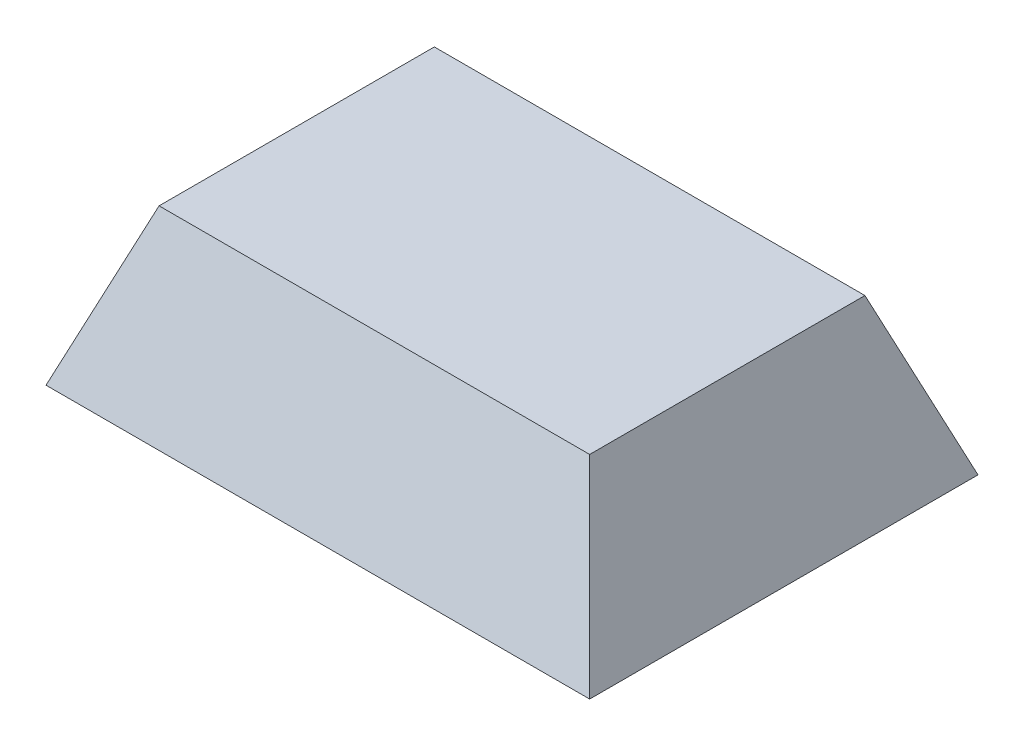
ISO-10303-21;
HEADER;
FILE_DESCRIPTION(('STEP AP214'),'2;1');
FILE_NAME('part.step','',(''),(''),'','','');
FILE_SCHEMA(('AUTOMOTIVE_DESIGN { 1 0 10303 214 1 1 1 1 }'));
ENDSEC;
DATA;
#1=APPLICATION_CONTEXT('core data for automotive mechanical design processes');
#2=APPLICATION_PROTOCOL_DEFINITION('international standard','automotive_design',2000,#1);
#3=PRODUCT_CONTEXT('',#1,'mechanical');
#4=PRODUCT('Part','Part','',(#3));
#5=PRODUCT_RELATED_PRODUCT_CATEGORY('part','',(#4));
#6=PRODUCT_DEFINITION_FORMATION('','',#4);
#7=PRODUCT_DEFINITION_CONTEXT('part definition',#1,'design');
#8=PRODUCT_DEFINITION('design','',#6,#7);
#9=PRODUCT_DEFINITION_SHAPE('','',#8);
#10=(LENGTH_UNIT() NAMED_UNIT(*) SI_UNIT(.MILLI.,.METRE.));
#11=(NAMED_UNIT(*) PLANE_ANGLE_UNIT() SI_UNIT($,.RADIAN.));
#12=(NAMED_UNIT(*) SI_UNIT($,.STERADIAN.) SOLID_ANGLE_UNIT());
#13=UNCERTAINTY_MEASURE_WITH_UNIT(LENGTH_MEASURE(1.E-05),#10,'distance_accuracy_value','');
#14=(GEOMETRIC_REPRESENTATION_CONTEXT(3) GLOBAL_UNCERTAINTY_ASSIGNED_CONTEXT((#13)) GLOBAL_UNIT_ASSIGNED_CONTEXT((#10,
#11,#12)) REPRESENTATION_CONTEXT('',''));
#15=CARTESIAN_POINT('',(0.,0.,0.));
#16=DIRECTION('',(0.,0.,1.));
#17=DIRECTION('',(1.,0.,0.));
#18=AXIS2_PLACEMENT_3D('',#15,#16,#17);
#19=CARTESIAN_POINT('',(0.,10.,0.));
#20=DIRECTION('',(0.,-1.,0.));
#21=DIRECTION('',(0.,0.,-1.));
#22=AXIS2_PLACEMENT_3D('',#19,#20,#21);
#23=PLANE('',#22);
#24=CARTESIAN_POINT('',(-27.72,10.,23.6311906293519));
#25=DIRECTION('',(0.,-1.,0.));
#26=DIRECTION('',(0.,0.,-1.));
#27=AXIS2_PLACEMENT_3D('',#24,#25,#26);
#28=CIRCLE('',#27,3.25);
#29=CARTESIAN_POINT('',(-27.72,10.,20.3811906293519));
#30=VERTEX_POINT('',#29);
#31=EDGE_CURVE('E362',#30,#30,#28,.F.);
#32=ORIENTED_EDGE('',*,*,#31,.T.);
#33=EDGE_LOOP('',(#32));
#34=FACE_BOUND('',#33,.T.);
#35=DIRECTION('',(0.,0.,-1.));
#36=VECTOR('',#35,1.);
#37=CARTESIAN_POINT('',(20.22,10.,0.));
#38=LINE('',#37,#36);
#39=CARTESIAN_POINT('',(20.22,9.99999999999999,41.0394087949584));
#40=VERTEX_POINT('',#39);
#41=CARTESIAN_POINT('',(20.22,10.,-16.1311906293518));
#42=VERTEX_POINT('',#41);
#43=EDGE_CURVE('E241',#40,#42,#38,.T.);
#44=ORIENTED_EDGE('',*,*,#43,.T.);
#45=DIRECTION('',(1.,0.,0.));
#46=VECTOR('',#45,1.);
#47=CARTESIAN_POINT('',(0.,10.,-16.1311906293518));
#48=LINE('',#47,#46);
#49=CARTESIAN_POINT('',(-20.22,10.,-16.1311906293518));
#50=VERTEX_POINT('',#49);
#51=EDGE_CURVE('E227',#50,#42,#48,.T.);
#52=ORIENTED_EDGE('',*,*,#51,.F.);
#53=DIRECTION('',(0.,0.,-1.));
#54=VECTOR('',#53,1.);
#55=CARTESIAN_POINT('',(-20.22,10.,0.));
#56=LINE('',#55,#54);
#57=CARTESIAN_POINT('',(-20.22,10.,41.0394087949584));
#58=VERTEX_POINT('',#57);
#59=EDGE_CURVE('E239',#58,#50,#56,.T.);
#60=ORIENTED_EDGE('',*,*,#59,.F.);
#61=DIRECTION('',(1.,0.,0.));
#62=VECTOR('',#61,1.);
#63=CARTESIAN_POINT('',(-70.,10.,41.0394087949584));
#64=LINE('',#63,#62);
#65=CARTESIAN_POINT('',(-35.22,10.,41.0394087949584));
#66=VERTEX_POINT('',#65);
#67=EDGE_CURVE('E92',#58,#66,#64,.F.);
#68=ORIENTED_EDGE('',*,*,#67,.T.);
#69=DIRECTION('',(0.,0.,-1.));
#70=VECTOR('',#69,1.);
#71=CARTESIAN_POINT('',(-35.22,10.,0.));
#72=LINE('',#71,#70);
#73=CARTESIAN_POINT('',(-35.22,10.,-41.0394087949584));
#74=VERTEX_POINT('',#73);
#75=EDGE_CURVE('E254',#66,#74,#72,.T.);
#76=ORIENTED_EDGE('',*,*,#75,.T.);
#77=DIRECTION('',(-1.,0.,0.));
#78=VECTOR('',#77,1.);
#79=CARTESIAN_POINT('',(-70.,10.,-41.0394087949584));
#80=LINE('',#79,#78);
#81=CARTESIAN_POINT('',(-20.22,10.,-41.0394087949584));
#82=VERTEX_POINT('',#81);
#83=EDGE_CURVE('E260',#74,#82,#80,.F.);
#84=ORIENTED_EDGE('',*,*,#83,.T.);
#85=CARTESIAN_POINT('',(-20.22,10.,-31.1311906293519));
#86=VERTEX_POINT('',#85);
#87=EDGE_CURVE('E249',#86,#82,#56,.T.);
#88=ORIENTED_EDGE('',*,*,#87,.F.);
#89=DIRECTION('',(-1.,0.,0.));
#90=VECTOR('',#89,1.);
#91=CARTESIAN_POINT('',(0.,10.,-31.1311906293518));
#92=LINE('',#91,#90);
#93=CARTESIAN_POINT('',(20.22,10.,-31.1311906293519));
#94=VERTEX_POINT('',#93);
#95=EDGE_CURVE('E242',#94,#86,#92,.T.);
#96=ORIENTED_EDGE('',*,*,#95,.F.);
#97=CARTESIAN_POINT('',(20.22,9.99999999999999,-41.0394087949584));
#98=VERTEX_POINT('',#97);
#99=EDGE_CURVE('E100',#94,#98,#38,.T.);
#100=ORIENTED_EDGE('',*,*,#99,.T.);
#101=DIRECTION('',(-1.,0.,0.));
#102=VECTOR('',#101,1.);
#103=CARTESIAN_POINT('',(-70.,10.,-41.0394087949584));
#104=LINE('',#103,#102);
#105=CARTESIAN_POINT('',(35.22,10.,-41.0394087949584));
#106=VERTEX_POINT('',#105);
#107=EDGE_CURVE('E282',#98,#106,#104,.F.);
#108=ORIENTED_EDGE('',*,*,#107,.T.);
#109=DIRECTION('',(0.,0.,-1.));
#110=VECTOR('',#109,1.);
#111=CARTESIAN_POINT('',(35.22,10.,0.));
#112=LINE('',#111,#110);
#113=CARTESIAN_POINT('',(35.22,10.,41.0394087949584));
#114=VERTEX_POINT('',#113);
#115=EDGE_CURVE('E266',#114,#106,#112,.T.);
#116=ORIENTED_EDGE('',*,*,#115,.F.);
#117=DIRECTION('',(1.,0.,0.));
#118=VECTOR('',#117,1.);
#119=CARTESIAN_POINT('',(-70.,10.,41.0394087949584));
#120=LINE('',#119,#118);
#121=EDGE_CURVE('E354',#114,#40,#120,.F.);
#122=ORIENTED_EDGE('',*,*,#121,.T.);
#123=EDGE_LOOP('',(#44,#52,#60,#68,#76,#84,#88,#96,#100,#108,#116,#122));
#124=FACE_BOUND('',#123,.T.);
#125=CARTESIAN_POINT('',(0.,10.,-23.6311906293518));
#126=DIRECTION('',(0.,-1.,0.));
#127=DIRECTION('',(0.,0.,-1.));
#128=AXIS2_PLACEMENT_3D('',#125,#126,#127);
#129=CIRCLE('',#128,3.25);
#130=CARTESIAN_POINT('',(0.,10.,-26.8811906293518));
#131=VERTEX_POINT('',#130);
#132=EDGE_CURVE('E369',#131,#131,#129,.T.);
#133=ORIENTED_EDGE('',*,*,#132,.F.);
#134=EDGE_LOOP('',(#133));
#135=FACE_BOUND('',#134,.T.);
#136=CARTESIAN_POINT('',(27.72,10.,23.6311906293519));
#137=DIRECTION('',(0.,-1.,0.));
#138=DIRECTION('',(0.,0.,-1.));
#139=AXIS2_PLACEMENT_3D('',#136,#137,#138);
#140=CIRCLE('',#139,3.25);
#141=CARTESIAN_POINT('',(27.72,10.,20.3811906293519));
#142=VERTEX_POINT('',#141);
#143=EDGE_CURVE('E243',#142,#142,#140,.F.);
#144=ORIENTED_EDGE('',*,*,#143,.T.);
#145=EDGE_LOOP('',(#144));
#146=FACE_BOUND('',#145,.T.);
#147=ADVANCED_FACE('F83',(#34,#124,#135,#146),#23,.T.);
#148=CARTESIAN_POINT('',(20.22,10.,0.));
#149=DIRECTION('',(-0.939692620785908,0.342020143325669,0.));
#150=DIRECTION('',(-0.342020143325669,-0.939692620785908,0.));
#151=AXIS2_PLACEMENT_3D('',#148,#149,#150);
#152=PLANE('',#151);
#153=ORIENTED_EDGE('',*,*,#99,.F.);
#154=DIRECTION('',(-0.323615577118185,-0.889126490715988,0.323615577118185));
#155=VECTOR('',#154,1.);
#156=CARTESIAN_POINT('',(18.1024192157435,4.18199461138426,-29.0136098450953));
#157=LINE('',#156,#155);
#158=CARTESIAN_POINT('',(23.8597023426621,20.,-34.7708929720139));
#159=VERTEX_POINT('',#158);
#160=EDGE_CURVE('E379',#159,#94,#157,.T.);
#161=ORIENTED_EDGE('',*,*,#160,.F.);
#162=DIRECTION('',(0.,0.,-1.));
#163=VECTOR('',#162,1.);
#164=CARTESIAN_POINT('',(23.8597023426621,20.,0.));
#165=LINE('',#164,#163);
#166=CARTESIAN_POINT('',(23.8597023426621,20.,-37.3997064522964));
#167=VERTEX_POINT('',#166);
#168=EDGE_CURVE('E269',#159,#167,#165,.T.);
#169=ORIENTED_EDGE('',*,*,#168,.T.);
#170=DIRECTION('',(0.323615577118185,0.889126490715988,0.323615577118186));
#171=VECTOR('',#170,1.);
#172=CARTESIAN_POINT('',(6.95575825948803,-26.4432046682441,-54.3036505354704));
#173=LINE('',#172,#171);
#174=EDGE_CURVE('E277',#167,#98,#173,.F.);
#175=ORIENTED_EDGE('',*,*,#174,.T.);
#176=EDGE_LOOP('',(#153,#161,#169,#175));
#177=FACE_BOUND('',#176,.T.);
#178=ADVANCED_FACE('F427',(#177),#152,.T.);
#179=CARTESIAN_POINT('',(23.859702342662,20.,37.3997064522964));
#180=VERTEX_POINT('',#179);
#181=CARTESIAN_POINT('',(23.8597023426621,20.,-12.4914882866898));
#182=VERTEX_POINT('',#181);
#183=EDGE_CURVE('E270',#180,#182,#165,.T.);
#184=ORIENTED_EDGE('',*,*,#183,.T.);
#185=DIRECTION('',(-0.323615577118185,-0.889126490715988,-0.323615577118185));
#186=VECTOR('',#185,1.);
#187=CARTESIAN_POINT('',(21.9093718745744,14.6415110784548,-14.4418187547775));
#188=LINE('',#187,#186);
#189=EDGE_CURVE('E108',#182,#42,#188,.T.);
#190=ORIENTED_EDGE('',*,*,#189,.T.);
#191=ORIENTED_EDGE('',*,*,#43,.F.);
#192=DIRECTION('',(-0.323615577118185,-0.889126490715988,0.323615577118186));
#193=VECTOR('',#192,1.);
#194=CARTESIAN_POINT('',(6.95575825948803,-26.4432046682441,54.3036505354704));
#195=LINE('',#194,#193);
#196=EDGE_CURVE('E348',#40,#180,#195,.F.);
#197=ORIENTED_EDGE('',*,*,#196,.T.);
#198=EDGE_LOOP('',(#184,#190,#191,#197));
#199=FACE_BOUND('',#198,.T.);
#200=ADVANCED_FACE('F417',(#199),#152,.T.);
#201=CARTESIAN_POINT('',(-20.22,10.,0.));
#202=DIRECTION('',(0.939692620785908,0.342020143325669,0.));
#203=DIRECTION('',(-0.342020143325669,0.939692620785908,0.));
#204=AXIS2_PLACEMENT_3D('',#201,#202,#203);
#205=PLANE('',#204);
#206=DIRECTION('',(-0.323615577118185,0.889126490715988,-0.323615577118185));
#207=VECTOR('',#206,1.);
#208=CARTESIAN_POINT('',(-18.1024192157435,4.18199461138427,-29.0136098450953));
#209=LINE('',#208,#207);
#210=CARTESIAN_POINT('',(-23.859702342662,20.,-34.7708929720139));
#211=VERTEX_POINT('',#210);
#212=EDGE_CURVE('E234',#211,#86,#209,.F.);
#213=ORIENTED_EDGE('',*,*,#212,.T.);
#214=ORIENTED_EDGE('',*,*,#87,.T.);
#215=DIRECTION('',(0.323615577118185,-0.889126490715988,-0.323615577118186));
#216=VECTOR('',#215,1.);
#217=CARTESIAN_POINT('',(-21.617544104983,13.8397208711329,-39.6418646899753));
#218=LINE('',#217,#216);
#219=CARTESIAN_POINT('',(-23.859702342662,20.,-37.3997064522964));
#220=VERTEX_POINT('',#219);
#221=EDGE_CURVE('E252',#220,#82,#218,.T.);
#222=ORIENTED_EDGE('',*,*,#221,.F.);
#223=DIRECTION('',(0.,0.,1.));
#224=VECTOR('',#223,1.);
#225=CARTESIAN_POINT('',(-23.859702342662,20.,0.));
#226=LINE('',#225,#224);
#227=EDGE_CURVE('E391',#211,#220,#226,.F.);
#228=ORIENTED_EDGE('',*,*,#227,.F.);
#229=EDGE_LOOP('',(#213,#214,#222,#228));
#230=FACE_BOUND('',#229,.T.);
#231=ADVANCED_FACE('F402',(#230),#205,.T.);
#232=DIRECTION('',(-0.323615577118185,0.889126490715988,0.323615577118185));
#233=VECTOR('',#232,1.);
#234=CARTESIAN_POINT('',(-21.9093718745744,14.6415110784548,-14.4418187547775));
#235=LINE('',#234,#233);
#236=CARTESIAN_POINT('',(-23.859702342662,20.,-12.4914882866898));
#237=VERTEX_POINT('',#236);
#238=EDGE_CURVE('E224',#237,#50,#235,.F.);
#239=ORIENTED_EDGE('',*,*,#238,.F.);
#240=CARTESIAN_POINT('',(-23.859702342662,20.,37.3997064522964));
#241=VERTEX_POINT('',#240);
#242=EDGE_CURVE('E390',#241,#237,#226,.F.);
#243=ORIENTED_EDGE('',*,*,#242,.F.);
#244=DIRECTION('',(-0.323615577118185,0.889126490715988,-0.323615577118186));
#245=VECTOR('',#244,1.);
#246=CARTESIAN_POINT('',(-21.617544104983,13.8397208711329,39.6418646899754));
#247=LINE('',#246,#245);
#248=EDGE_CURVE('E247',#58,#241,#247,.T.);
#249=ORIENTED_EDGE('',*,*,#248,.F.);
#250=ORIENTED_EDGE('',*,*,#59,.T.);
#251=EDGE_LOOP('',(#239,#243,#249,#250));
#252=FACE_BOUND('',#251,.T.);
#253=ADVANCED_FACE('F245',(#252),#205,.T.);
#254=CARTESIAN_POINT('',(0.,0.,0.));
#255=DIRECTION('',(0.,-1.,0.));
#256=DIRECTION('',(0.,0.,-1.));
#257=AXIS2_PLACEMENT_3D('',#254,#255,#256);
#258=PLANE('',#257);
#259=DIRECTION('',(0.,0.,-1.));
#260=VECTOR('',#259,1.);
#261=CARTESIAN_POINT('',(70.,0.,50.));
#262=LINE('',#261,#260);
#263=CARTESIAN_POINT('',(70.,0.,50.));
#264=VERTEX_POINT('',#263);
#265=CARTESIAN_POINT('',(70.,0.,-50.));
#266=VERTEX_POINT('',#265);
#267=EDGE_CURVE('E288',#264,#266,#262,.T.);
#268=ORIENTED_EDGE('',*,*,#267,.F.);
#269=DIRECTION('',(1.,0.,0.));
#270=VECTOR('',#269,1.);
#271=CARTESIAN_POINT('',(-70.,0.,50.));
#272=LINE('',#271,#270);
#273=CARTESIAN_POINT('',(-70.,0.,50.));
#274=VERTEX_POINT('',#273);
#275=EDGE_CURVE('E322',#274,#264,#272,.T.);
#276=ORIENTED_EDGE('',*,*,#275,.F.);
#277=DIRECTION('',(0.,0.,1.));
#278=VECTOR('',#277,1.);
#279=CARTESIAN_POINT('',(-70.,0.,50.));
#280=LINE('',#279,#278);
#281=CARTESIAN_POINT('',(-70.,0.,-50.));
#282=VERTEX_POINT('',#281);
#283=EDGE_CURVE('E320',#282,#274,#280,.T.);
#284=ORIENTED_EDGE('',*,*,#283,.F.);
#285=DIRECTION('',(-1.,0.,0.));
#286=VECTOR('',#285,1.);
#287=CARTESIAN_POINT('',(-70.,0.,-50.));
#288=LINE('',#287,#286);
#289=EDGE_CURVE('E318',#266,#282,#288,.T.);
#290=ORIENTED_EDGE('',*,*,#289,.F.);
#291=EDGE_LOOP('',(#268,#276,#284,#290));
#292=FACE_BOUND('',#291,.T.);
#293=DIRECTION('',(-1.,0.,0.));
#294=VECTOR('',#293,1.);
#295=CARTESIAN_POINT('',(0.,0.,44.6791111376204));
#296=LINE('',#295,#294);
#297=CARTESIAN_POINT('',(-64.6791111376204,0.,44.6791111376205));
#298=VERTEX_POINT('',#297);
#299=CARTESIAN_POINT('',(64.6791111376205,0.,44.6791111376205));
#300=VERTEX_POINT('',#299);
#301=EDGE_CURVE('E294',#298,#300,#296,.F.);
#302=ORIENTED_EDGE('',*,*,#301,.T.);
#303=DIRECTION('',(0.,0.,1.));
#304=VECTOR('',#303,1.);
#305=CARTESIAN_POINT('',(64.6791111376204,0.,0.));
#306=LINE('',#305,#304);
#307=CARTESIAN_POINT('',(64.6791111376205,0.,-44.6791111376204));
#308=VERTEX_POINT('',#307);
#309=EDGE_CURVE('E284',#300,#308,#306,.F.);
#310=ORIENTED_EDGE('',*,*,#309,.T.);
#311=DIRECTION('',(1.,0.,0.));
#312=VECTOR('',#311,1.);
#313=CARTESIAN_POINT('',(0.,0.,-44.6791111376204));
#314=LINE('',#313,#312);
#315=CARTESIAN_POINT('',(-64.6791111376204,0.,-44.6791111376204));
#316=VERTEX_POINT('',#315);
#317=EDGE_CURVE('E308',#308,#316,#314,.F.);
#318=ORIENTED_EDGE('',*,*,#317,.T.);
#319=DIRECTION('',(0.,0.,-1.));
#320=VECTOR('',#319,1.);
#321=CARTESIAN_POINT('',(-64.6791111376204,0.,0.));
#322=LINE('',#321,#320);
#323=EDGE_CURVE('E311',#316,#298,#322,.F.);
#324=ORIENTED_EDGE('',*,*,#323,.T.);
#325=EDGE_LOOP('',(#302,#310,#318,#324));
#326=FACE_BOUND('',#325,.T.);
#327=ADVANCED_FACE('F472',(#292,#326),#258,.T.);
#328=CARTESIAN_POINT('',(70.,0.,50.));
#329=DIRECTION('',(0.939692620785908,0.34202014332567,0.));
#330=DIRECTION('',(-0.34202014332567,0.939692620785908,0.));
#331=AXIS2_PLACEMENT_3D('',#328,#329,#330);
#332=PLANE('',#331);
#333=ORIENTED_EDGE('',*,*,#267,.T.);
#334=DIRECTION('',(0.323615577118186,-0.889126490715988,-0.323615577118186));
#335=VECTOR('',#334,1.);
#336=CARTESIAN_POINT('',(55.3382141545049,40.282925539377,-35.3382141545049));
#337=LINE('',#336,#335);
#338=CARTESIAN_POINT('',(55.4411906293519,40.,-35.4411906293518));
#339=VERTEX_POINT('',#338);
#340=EDGE_CURVE('E325',#339,#266,#337,.T.);
#341=ORIENTED_EDGE('',*,*,#340,.F.);
#342=DIRECTION('',(0.,0.,1.));
#343=VECTOR('',#342,1.);
#344=CARTESIAN_POINT('',(55.4411906293519,40.,0.));
#345=LINE('',#344,#343);
#346=CARTESIAN_POINT('',(55.4411906293519,40.,35.4411906293519));
#347=VERTEX_POINT('',#346);
#348=EDGE_CURVE('E324',#347,#339,#345,.F.);
#349=ORIENTED_EDGE('',*,*,#348,.F.);
#350=DIRECTION('',(0.323615577118186,-0.889126490715988,0.323615577118186));
#351=VECTOR('',#350,1.);
#352=CARTESIAN_POINT('',(70.,0.,50.));
#353=LINE('',#352,#351);
#354=EDGE_CURVE('E330',#347,#264,#353,.T.);
#355=ORIENTED_EDGE('',*,*,#354,.T.);
#356=EDGE_LOOP('',(#333,#341,#349,#355));
#357=FACE_BOUND('',#356,.T.);
#358=ADVANCED_FACE('F475',(#357),#332,.T.);
#359=CARTESIAN_POINT('',(-70.,0.,-50.));
#360=DIRECTION('',(0.,0.34202014332567,-0.939692620785908));
#361=DIRECTION('',(0.,0.939692620785908,0.34202014332567));
#362=AXIS2_PLACEMENT_3D('',#359,#360,#361);
#363=PLANE('',#362);
#364=ORIENTED_EDGE('',*,*,#289,.T.);
#365=DIRECTION('',(-0.323615577118186,-0.889126490715988,-0.323615577118186));
#366=VECTOR('',#365,1.);
#367=CARTESIAN_POINT('',(-59.5272958246464,28.7735182424121,-39.5272958246464));
#368=LINE('',#367,#366);
#369=CARTESIAN_POINT('',(-55.4411906293518,40.,-35.4411906293518));
#370=VERTEX_POINT('',#369);
#371=EDGE_CURVE('E329',#370,#282,#368,.T.);
#372=ORIENTED_EDGE('',*,*,#371,.F.);
#373=DIRECTION('',(1.,0.,0.));
#374=VECTOR('',#373,1.);
#375=CARTESIAN_POINT('',(0.,40.,-35.4411906293518));
#376=LINE('',#375,#374);
#377=EDGE_CURVE('E341',#339,#370,#376,.F.);
#378=ORIENTED_EDGE('',*,*,#377,.F.);
#379=ORIENTED_EDGE('',*,*,#340,.T.);
#380=EDGE_LOOP('',(#364,#372,#378,#379));
#381=FACE_BOUND('',#380,.T.);
#382=ADVANCED_FACE('F85',(#381),#363,.T.);
#383=CARTESIAN_POINT('',(-70.,0.,50.));
#384=DIRECTION('',(-0.939692620785908,0.34202014332567,0.));
#385=DIRECTION('',(-0.34202014332567,-0.939692620785908,0.));
#386=AXIS2_PLACEMENT_3D('',#383,#384,#385);
#387=PLANE('',#386);
#388=ORIENTED_EDGE('',*,*,#283,.T.);
#389=DIRECTION('',(-0.323615577118186,-0.889126490715988,0.323615577118186));
#390=VECTOR('',#389,1.);
#391=CARTESIAN_POINT('',(-70.,0.,50.));
#392=LINE('',#391,#390);
#393=CARTESIAN_POINT('',(-55.4411906293518,40.,35.4411906293519));
#394=VERTEX_POINT('',#393);
#395=EDGE_CURVE('E333',#394,#274,#392,.T.);
#396=ORIENTED_EDGE('',*,*,#395,.F.);
#397=DIRECTION('',(0.,0.,-1.));
#398=VECTOR('',#397,1.);
#399=CARTESIAN_POINT('',(-55.4411906293518,40.,0.));
#400=LINE('',#399,#398);
#401=EDGE_CURVE('E343',#370,#394,#400,.F.);
#402=ORIENTED_EDGE('',*,*,#401,.F.);
#403=ORIENTED_EDGE('',*,*,#371,.T.);
#404=EDGE_LOOP('',(#388,#396,#402,#403));
#405=FACE_BOUND('',#404,.T.);
#406=ADVANCED_FACE('F481',(#405),#387,.T.);
#407=CARTESIAN_POINT('',(-70.,0.,50.));
#408=DIRECTION('',(0.,0.34202014332567,0.939692620785908));
#409=DIRECTION('',(0.,-0.939692620785908,0.34202014332567));
#410=AXIS2_PLACEMENT_3D('',#407,#408,#409);
#411=PLANE('',#410);
#412=ORIENTED_EDGE('',*,*,#275,.T.);
#413=ORIENTED_EDGE('',*,*,#354,.F.);
#414=DIRECTION('',(-1.,0.,0.));
#415=VECTOR('',#414,1.);
#416=CARTESIAN_POINT('',(0.,40.,35.4411906293519));
#417=LINE('',#416,#415);
#418=EDGE_CURVE('E334',#394,#347,#417,.F.);
#419=ORIENTED_EDGE('',*,*,#418,.F.);
#420=ORIENTED_EDGE('',*,*,#395,.T.);
#421=EDGE_LOOP('',(#412,#413,#419,#420));
#422=FACE_BOUND('',#421,.T.);
#423=ADVANCED_FACE('F470',(#422),#411,.T.);
#424=CARTESIAN_POINT('',(0.,40.,0.));
#425=DIRECTION('',(0.,-1.,0.));
#426=DIRECTION('',(0.,0.,-1.));
#427=AXIS2_PLACEMENT_3D('',#424,#425,#426);
#428=PLANE('',#427);
#429=ORIENTED_EDGE('',*,*,#348,.T.);
#430=ORIENTED_EDGE('',*,*,#377,.T.);
#431=ORIENTED_EDGE('',*,*,#401,.T.);
#432=ORIENTED_EDGE('',*,*,#418,.T.);
#433=EDGE_LOOP('',(#429,#430,#431,#432));
#434=FACE_BOUND('',#433,.T.);
#435=ADVANCED_FACE('F455',(#434),#428,.F.);
#436=CARTESIAN_POINT('',(65.3015368960705,-1.71010071662835,50.));
#437=DIRECTION('',(0.939692620785908,0.34202014332567,0.));
#438=DIRECTION('',(-0.34202014332567,0.939692620785908,0.));
#439=AXIS2_PLACEMENT_3D('',#436,#437,#438);
#440=PLANE('',#439);
#441=ORIENTED_EDGE('',*,*,#309,.F.);
#442=DIRECTION('',(0.323615577118186,-0.889126490715988,0.323615577118186));
#443=VECTOR('',#442,1.);
#444=CARTESIAN_POINT('',(65.7935930377331,-3.06201385495052,45.7935930377332));
#445=LINE('',#444,#443);
#446=CARTESIAN_POINT('',(51.9401529383033,35.,31.9401529383033));
#447=VERTEX_POINT('',#446);
#448=EDGE_CURVE('E295',#447,#300,#445,.T.);
#449=ORIENTED_EDGE('',*,*,#448,.F.);
#450=DIRECTION('',(0.,0.,1.));
#451=VECTOR('',#450,1.);
#452=CARTESIAN_POINT('',(51.9401529383033,35.,0.));
#453=LINE('',#452,#451);
#454=CARTESIAN_POINT('',(51.9401529383033,35.,-31.9401529383033));
#455=VERTEX_POINT('',#454);
#456=EDGE_CURVE('E290',#447,#455,#453,.F.);
#457=ORIENTED_EDGE('',*,*,#456,.T.);
#458=DIRECTION('',(0.323615577118186,-0.889126490715988,-0.323615577118186));
#459=VECTOR('',#458,1.);
#460=CARTESIAN_POINT('',(51.1318071922381,37.2209116844265,-31.1318071922381));
#461=LINE('',#460,#459);
#462=EDGE_CURVE('E285',#455,#308,#461,.T.);
#463=ORIENTED_EDGE('',*,*,#462,.T.);
#464=EDGE_LOOP('',(#441,#449,#457,#463));
#465=FACE_BOUND('',#464,.T.);
#466=ADVANCED_FACE('F452',(#465),#440,.F.);
#467=CARTESIAN_POINT('',(-70.,-1.71010071662835,-45.3015368960705));
#468=DIRECTION('',(0.,0.34202014332567,-0.939692620785908));
#469=DIRECTION('',(0.,0.939692620785908,0.34202014332567));
#470=AXIS2_PLACEMENT_3D('',#467,#468,#469);
#471=PLANE('',#470);
#472=DIRECTION('',(0.323615577118185,0.889126490715988,0.323615577118186));
#473=VECTOR('',#472,1.);
#474=CARTESIAN_POINT('',(-42.678174545696,-10.4911661546508,-48.4975833406544));
#475=LINE('',#474,#473);
#476=CARTESIAN_POINT('',(-31.580297657338,20.,-37.3997064522964));
#477=VERTEX_POINT('',#476);
#478=EDGE_CURVE('E263',#477,#74,#475,.F.);
#479=ORIENTED_EDGE('',*,*,#478,.F.);
#480=DIRECTION('',(-1.,0.,0.));
#481=VECTOR('',#480,1.);
#482=CARTESIAN_POINT('',(-70.,20.,-37.3997064522964));
#483=LINE('',#482,#481);
#484=EDGE_CURVE('E248',#477,#220,#483,.F.);
#485=ORIENTED_EDGE('',*,*,#484,.T.);
#486=ORIENTED_EDGE('',*,*,#221,.T.);
#487=ORIENTED_EDGE('',*,*,#83,.F.);
#488=EDGE_LOOP('',(#479,#485,#486,#487));
#489=FACE_BOUND('',#488,.T.);
#490=ORIENTED_EDGE('',*,*,#107,.F.);
#491=ORIENTED_EDGE('',*,*,#174,.F.);
#492=DIRECTION('',(-1.,0.,0.));
#493=VECTOR('',#492,1.);
#494=CARTESIAN_POINT('',(-70.,20.,-37.3997064522964));
#495=LINE('',#494,#493);
#496=CARTESIAN_POINT('',(31.580297657338,20.,-37.3997064522964));
#497=VERTEX_POINT('',#496);
#498=EDGE_CURVE('E274',#167,#497,#495,.F.);
#499=ORIENTED_EDGE('',*,*,#498,.T.);
#500=DIRECTION('',(0.323615577118185,-0.889126490715988,-0.323615577118186));
#501=VECTOR('',#500,1.);
#502=CARTESIAN_POINT('',(28.0163887002009,29.7917593847261,-33.8357974951593));
#503=LINE('',#502,#501);
#504=EDGE_CURVE('E279',#497,#106,#503,.T.);
#505=ORIENTED_EDGE('',*,*,#504,.T.);
#506=EDGE_LOOP('',(#490,#491,#499,#505));
#507=FACE_BOUND('',#506,.T.);
#508=ORIENTED_EDGE('',*,*,#317,.F.);
#509=ORIENTED_EDGE('',*,*,#462,.F.);
#510=DIRECTION('',(1.,0.,0.));
#511=VECTOR('',#510,1.);
#512=CARTESIAN_POINT('',(0.,35.,-31.9401529383033));
#513=LINE('',#512,#511);
#514=CARTESIAN_POINT('',(-51.9401529383033,35.,-31.9401529383033));
#515=VERTEX_POINT('',#514);
#516=EDGE_CURVE('E293',#455,#515,#513,.F.);
#517=ORIENTED_EDGE('',*,*,#516,.T.);
#518=DIRECTION('',(-0.323615577118186,-0.889126490715988,-0.323615577118186));
#519=VECTOR('',#518,1.);
#520=CARTESIAN_POINT('',(-55.3208888623795,25.7115043874616,-35.3208888623795));
#521=LINE('',#520,#519);
#522=EDGE_CURVE('E289',#515,#316,#521,.T.);
#523=ORIENTED_EDGE('',*,*,#522,.T.);
#524=EDGE_LOOP('',(#508,#509,#517,#523));
#525=FACE_BOUND('',#524,.T.);
#526=ADVANCED_FACE('F406',(#489,#507,#525),#471,.F.);
#527=CARTESIAN_POINT('',(-65.3015368960704,-1.71010071662835,50.));
#528=DIRECTION('',(-0.939692620785908,0.34202014332567,0.));
#529=DIRECTION('',(-0.34202014332567,-0.939692620785908,0.));
#530=AXIS2_PLACEMENT_3D('',#527,#528,#529);
#531=PLANE('',#530);
#532=ORIENTED_EDGE('',*,*,#323,.F.);
#533=ORIENTED_EDGE('',*,*,#522,.F.);
#534=DIRECTION('',(0.,0.,-1.));
#535=VECTOR('',#534,1.);
#536=CARTESIAN_POINT('',(-51.9401529383033,35.,0.));
#537=LINE('',#536,#535);
#538=CARTESIAN_POINT('',(-51.9401529383033,35.,31.9401529383033));
#539=VERTEX_POINT('',#538);
#540=EDGE_CURVE('E302',#515,#539,#537,.F.);
#541=ORIENTED_EDGE('',*,*,#540,.T.);
#542=DIRECTION('',(-0.323615577118186,-0.889126490715988,0.323615577118186));
#543=VECTOR('',#542,1.);
#544=CARTESIAN_POINT('',(-65.7935930377331,-3.06201385495052,45.7935930377332));
#545=LINE('',#544,#543);
#546=EDGE_CURVE('E297',#539,#298,#545,.T.);
#547=ORIENTED_EDGE('',*,*,#546,.T.);
#548=EDGE_LOOP('',(#532,#533,#541,#547));
#549=FACE_BOUND('',#548,.T.);
#550=ADVANCED_FACE('F459',(#549),#531,.F.);
#551=CARTESIAN_POINT('',(-70.,-1.71010071662835,45.3015368960705));
#552=DIRECTION('',(0.,0.34202014332567,0.939692620785908));
#553=DIRECTION('',(0.,-0.939692620785908,0.34202014332567));
#554=AXIS2_PLACEMENT_3D('',#551,#552,#553);
#555=PLANE('',#554);
#556=DIRECTION('',(-0.323615577118185,-0.889126490715988,0.323615577118186));
#557=VECTOR('',#556,1.);
#558=CARTESIAN_POINT('',(-42.678174545696,-10.4911661546508,48.4975833406544));
#559=LINE('',#558,#557);
#560=CARTESIAN_POINT('',(-31.580297657338,20.,37.3997064522964));
#561=VERTEX_POINT('',#560);
#562=EDGE_CURVE('E12',#66,#561,#559,.F.);
#563=ORIENTED_EDGE('',*,*,#562,.F.);
#564=ORIENTED_EDGE('',*,*,#67,.F.);
#565=ORIENTED_EDGE('',*,*,#248,.T.);
#566=DIRECTION('',(1.,0.,0.));
#567=VECTOR('',#566,1.);
#568=CARTESIAN_POINT('',(-70.,20.,37.3997064522964));
#569=LINE('',#568,#567);
#570=EDGE_CURVE('E356',#241,#561,#569,.F.);
#571=ORIENTED_EDGE('',*,*,#570,.T.);
#572=EDGE_LOOP('',(#563,#564,#565,#571));
#573=FACE_BOUND('',#572,.T.);
#574=ORIENTED_EDGE('',*,*,#121,.F.);
#575=DIRECTION('',(-0.323615577118185,0.889126490715988,-0.323615577118186));
#576=VECTOR('',#575,1.);
#577=CARTESIAN_POINT('',(28.0163887002009,29.7917593847261,33.8357974951593));
#578=LINE('',#577,#576);
#579=CARTESIAN_POINT('',(31.580297657338,20.,37.3997064522964));
#580=VERTEX_POINT('',#579);
#581=EDGE_CURVE('E351',#114,#580,#578,.T.);
#582=ORIENTED_EDGE('',*,*,#581,.T.);
#583=DIRECTION('',(1.,0.,0.));
#584=VECTOR('',#583,1.);
#585=CARTESIAN_POINT('',(-70.,20.,37.3997064522964));
#586=LINE('',#585,#584);
#587=EDGE_CURVE('E328',#580,#180,#586,.F.);
#588=ORIENTED_EDGE('',*,*,#587,.T.);
#589=ORIENTED_EDGE('',*,*,#196,.F.);
#590=EDGE_LOOP('',(#574,#582,#588,#589));
#591=FACE_BOUND('',#590,.T.);
#592=ORIENTED_EDGE('',*,*,#301,.F.);
#593=ORIENTED_EDGE('',*,*,#546,.F.);
#594=DIRECTION('',(-1.,0.,0.));
#595=VECTOR('',#594,1.);
#596=CARTESIAN_POINT('',(0.,35.,31.9401529383033));
#597=LINE('',#596,#595);
#598=EDGE_CURVE('E298',#539,#447,#597,.F.);
#599=ORIENTED_EDGE('',*,*,#598,.T.);
#600=ORIENTED_EDGE('',*,*,#448,.T.);
#601=EDGE_LOOP('',(#592,#593,#599,#600));
#602=FACE_BOUND('',#601,.T.);
#603=ADVANCED_FACE('F413',(#573,#591,#602),#555,.F.);
#604=CARTESIAN_POINT('',(0.,35.,0.));
#605=DIRECTION('',(0.,-1.,0.));
#606=DIRECTION('',(0.,0.,-1.));
#607=AXIS2_PLACEMENT_3D('',#604,#605,#606);
#608=PLANE('',#607);
#609=ORIENTED_EDGE('',*,*,#456,.F.);
#610=ORIENTED_EDGE('',*,*,#598,.F.);
#611=ORIENTED_EDGE('',*,*,#540,.F.);
#612=ORIENTED_EDGE('',*,*,#516,.F.);
#613=EDGE_LOOP('',(#609,#610,#611,#612));
#614=FACE_BOUND('',#613,.T.);
#615=ADVANCED_FACE('F451',(#614),#608,.T.);
#616=CARTESIAN_POINT('',(35.22,10.,0.));
#617=DIRECTION('',(0.939692620785908,0.342020143325669,0.));
#618=DIRECTION('',(-0.342020143325669,0.939692620785908,0.));
#619=AXIS2_PLACEMENT_3D('',#616,#617,#618);
#620=PLANE('',#619);
#621=ORIENTED_EDGE('',*,*,#504,.F.);
#622=DIRECTION('',(0.,0.,1.));
#623=VECTOR('',#622,1.);
#624=CARTESIAN_POINT('',(31.580297657338,20.,0.));
#625=LINE('',#624,#623);
#626=EDGE_CURVE('E272',#580,#497,#625,.F.);
#627=ORIENTED_EDGE('',*,*,#626,.F.);
#628=ORIENTED_EDGE('',*,*,#581,.F.);
#629=ORIENTED_EDGE('',*,*,#115,.T.);
#630=EDGE_LOOP('',(#621,#627,#628,#629));
#631=FACE_BOUND('',#630,.T.);
#632=ADVANCED_FACE('F423',(#631),#620,.T.);
#633=CARTESIAN_POINT('',(0.,20.,0.));
#634=DIRECTION('',(0.,-1.,0.));
#635=DIRECTION('',(0.,0.,-1.));
#636=AXIS2_PLACEMENT_3D('',#633,#634,#635);
#637=PLANE('',#636);
#638=CARTESIAN_POINT('',(27.72,20.,23.6311906293519));
#639=DIRECTION('',(0.,-1.,0.));
#640=DIRECTION('',(0.,0.,-1.));
#641=AXIS2_PLACEMENT_3D('',#638,#639,#640);
#642=CIRCLE('',#641,3.25);
#643=CARTESIAN_POINT('',(27.72,20.,20.3811906293519));
#644=VERTEX_POINT('',#643);
#645=EDGE_CURVE('E87',#644,#644,#642,.F.);
#646=ORIENTED_EDGE('',*,*,#645,.F.);
#647=EDGE_LOOP('',(#646));
#648=FACE_BOUND('',#647,.T.);
#649=CARTESIAN_POINT('',(-27.72,20.,23.6311906293519));
#650=DIRECTION('',(0.,-1.,0.));
#651=DIRECTION('',(0.,0.,-1.));
#652=AXIS2_PLACEMENT_3D('',#649,#650,#651);
#653=CIRCLE('',#652,3.25);
#654=CARTESIAN_POINT('',(-27.72,20.,20.3811906293519));
#655=VERTEX_POINT('',#654);
#656=EDGE_CURVE('E360',#655,#655,#653,.F.);
#657=ORIENTED_EDGE('',*,*,#656,.F.);
#658=EDGE_LOOP('',(#657));
#659=FACE_BOUND('',#658,.T.);
#660=CARTESIAN_POINT('',(0.,20.,-23.6311906293518));
#661=DIRECTION('',(0.,-1.,0.));
#662=DIRECTION('',(0.,0.,-1.));
#663=AXIS2_PLACEMENT_3D('',#660,#661,#662);
#664=CIRCLE('',#663,3.25);
#665=CARTESIAN_POINT('',(0.,20.,-26.8811906293518));
#666=VERTEX_POINT('',#665);
#667=EDGE_CURVE('E363',#666,#666,#664,.F.);
#668=ORIENTED_EDGE('',*,*,#667,.F.);
#669=EDGE_LOOP('',(#668));
#670=FACE_BOUND('',#669,.T.);
#671=ORIENTED_EDGE('',*,*,#498,.F.);
#672=ORIENTED_EDGE('',*,*,#168,.F.);
#673=DIRECTION('',(1.,0.,0.));
#674=VECTOR('',#673,1.);
#675=CARTESIAN_POINT('',(0.,20.,-34.7708929720139));
#676=LINE('',#675,#674);
#677=EDGE_CURVE('E383',#159,#211,#676,.F.);
#678=ORIENTED_EDGE('',*,*,#677,.T.);
#679=ORIENTED_EDGE('',*,*,#227,.T.);
#680=ORIENTED_EDGE('',*,*,#484,.F.);
#681=DIRECTION('',(0.,0.,-1.));
#682=VECTOR('',#681,1.);
#683=CARTESIAN_POINT('',(-31.580297657338,20.,0.));
#684=LINE('',#683,#682);
#685=EDGE_CURVE('E382',#561,#477,#684,.T.);
#686=ORIENTED_EDGE('',*,*,#685,.F.);
#687=ORIENTED_EDGE('',*,*,#570,.F.);
#688=ORIENTED_EDGE('',*,*,#242,.T.);
#689=DIRECTION('',(-1.,0.,0.));
#690=VECTOR('',#689,1.);
#691=CARTESIAN_POINT('',(0.,20.,-12.4914882866898));
#692=LINE('',#691,#690);
#693=EDGE_CURVE('E229',#237,#182,#692,.F.);
#694=ORIENTED_EDGE('',*,*,#693,.T.);
#695=ORIENTED_EDGE('',*,*,#183,.F.);
#696=ORIENTED_EDGE('',*,*,#587,.F.);
#697=ORIENTED_EDGE('',*,*,#626,.T.);
#698=EDGE_LOOP('',(#671,#672,#678,#679,#680,#686,#687,#688,#694,#695,#696,#697));
#699=FACE_BOUND('',#698,.T.);
#700=ADVANCED_FACE('F399',(#648,#659,#670,#699),#637,.F.);
#701=CARTESIAN_POINT('',(-35.22,10.,0.));
#702=DIRECTION('',(-0.939692620785908,0.342020143325669,0.));
#703=DIRECTION('',(-0.342020143325669,-0.939692620785908,0.));
#704=AXIS2_PLACEMENT_3D('',#701,#702,#703);
#705=PLANE('',#704);
#706=ORIENTED_EDGE('',*,*,#685,.T.);
#707=ORIENTED_EDGE('',*,*,#478,.T.);
#708=ORIENTED_EDGE('',*,*,#75,.F.);
#709=ORIENTED_EDGE('',*,*,#562,.T.);
#710=EDGE_LOOP('',(#706,#707,#708,#709));
#711=FACE_BOUND('',#710,.T.);
#712=ADVANCED_FACE('F410',(#711),#705,.T.);
#713=CARTESIAN_POINT('',(0.,10.,-31.1311906293518));
#714=DIRECTION('',(0.,-0.342020143325669,-0.939692620785908));
#715=DIRECTION('',(0.,0.939692620785908,-0.342020143325669));
#716=AXIS2_PLACEMENT_3D('',#713,#714,#715);
#717=PLANE('',#716);
#718=ORIENTED_EDGE('',*,*,#95,.T.);
#719=ORIENTED_EDGE('',*,*,#212,.F.);
#720=ORIENTED_EDGE('',*,*,#677,.F.);
#721=ORIENTED_EDGE('',*,*,#160,.T.);
#722=EDGE_LOOP('',(#718,#719,#720,#721));
#723=FACE_BOUND('',#722,.T.);
#724=ADVANCED_FACE('F429',(#723),#717,.T.);
#725=CARTESIAN_POINT('',(0.,10.,-16.1311906293518));
#726=DIRECTION('',(0.,-0.342020143325669,0.939692620785908));
#727=DIRECTION('',(0.,-0.939692620785908,-0.342020143325669));
#728=AXIS2_PLACEMENT_3D('',#725,#726,#727);
#729=PLANE('',#728);
#730=ORIENTED_EDGE('',*,*,#51,.T.);
#731=ORIENTED_EDGE('',*,*,#189,.F.);
#732=ORIENTED_EDGE('',*,*,#693,.F.);
#733=ORIENTED_EDGE('',*,*,#238,.T.);
#734=EDGE_LOOP('',(#730,#731,#732,#733));
#735=FACE_BOUND('',#734,.T.);
#736=ADVANCED_FACE('F226',(#735),#729,.T.);
#737=CARTESIAN_POINT('',(0.,0.,-23.6311906293518));
#738=DIRECTION('',(0.,1.,0.));
#739=DIRECTION('',(0.,0.,1.));
#740=AXIS2_PLACEMENT_3D('',#737,#738,#739);
#741=CYLINDRICAL_SURFACE('',#740,3.25);
#742=ORIENTED_EDGE('',*,*,#132,.T.);
#743=EDGE_LOOP('',(#742));
#744=FACE_BOUND('',#743,.T.);
#745=ORIENTED_EDGE('',*,*,#667,.T.);
#746=EDGE_LOOP('',(#745));
#747=FACE_BOUND('',#746,.T.);
#748=ADVANCED_FACE('F436',(#744,#747),#741,.F.);
#749=CARTESIAN_POINT('',(-27.72,0.,23.6311906293519));
#750=DIRECTION('',(0.,1.,0.));
#751=DIRECTION('',(0.,0.,1.));
#752=AXIS2_PLACEMENT_3D('',#749,#750,#751);
#753=CYLINDRICAL_SURFACE('',#752,3.25);
#754=ORIENTED_EDGE('',*,*,#31,.F.);
#755=EDGE_LOOP('',(#754));
#756=FACE_BOUND('',#755,.T.);
#757=ORIENTED_EDGE('',*,*,#656,.T.);
#758=EDGE_LOOP('',(#757));
#759=FACE_BOUND('',#758,.T.);
#760=ADVANCED_FACE('F621',(#756,#759),#753,.F.);
#761=CARTESIAN_POINT('',(27.72,0.,23.6311906293519));
#762=DIRECTION('',(0.,1.,0.));
#763=DIRECTION('',(0.,0.,1.));
#764=AXIS2_PLACEMENT_3D('',#761,#762,#763);
#765=CYLINDRICAL_SURFACE('',#764,3.25);
#766=ORIENTED_EDGE('',*,*,#143,.F.);
#767=EDGE_LOOP('',(#766));
#768=FACE_BOUND('',#767,.T.);
#769=ORIENTED_EDGE('',*,*,#645,.T.);
#770=EDGE_LOOP('',(#769));
#771=FACE_BOUND('',#770,.T.);
#772=ADVANCED_FACE('F631',(#768,#771),#765,.F.);
#773=CLOSED_SHELL('',(#147,#178,#200,#231,#253,#327,#358,#382,#406,#423,#435,#466,#526,#550,
#603,#615,#632,#700,#712,#724,#736,#748,#760,#772));
#774=MANIFOLD_SOLID_BREP('B2',#773);
#775=ADVANCED_BREP_SHAPE_REPRESENTATION('',(#18,#774),#14);
#776=SHAPE_DEFINITION_REPRESENTATION(#9,#775);
ENDSEC;
END-ISO-10303-21;
